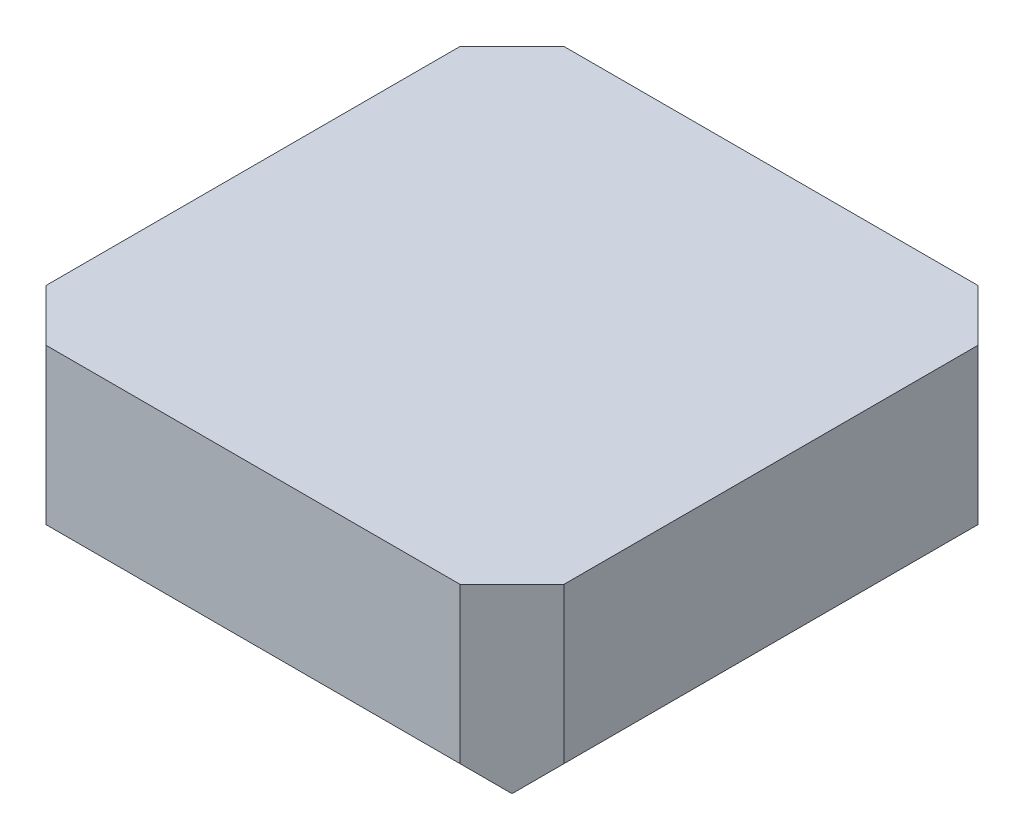
ISO-10303-21;
HEADER;
FILE_DESCRIPTION(('STEP AP214'),'2;1');
FILE_NAME('part.step','',(''),(''),'','','');
FILE_SCHEMA(('AUTOMOTIVE_DESIGN { 1 0 10303 214 1 1 1 1 }'));
ENDSEC;
DATA;
#1=APPLICATION_CONTEXT('core data for automotive mechanical design processes');
#2=APPLICATION_PROTOCOL_DEFINITION('international standard','automotive_design',2000,#1);
#3=PRODUCT_CONTEXT('',#1,'mechanical');
#4=PRODUCT('Part','Part','',(#3));
#5=PRODUCT_RELATED_PRODUCT_CATEGORY('part','',(#4));
#6=PRODUCT_DEFINITION_FORMATION('','',#4);
#7=PRODUCT_DEFINITION_CONTEXT('part definition',#1,'design');
#8=PRODUCT_DEFINITION('design','',#6,#7);
#9=PRODUCT_DEFINITION_SHAPE('','',#8);
#10=(LENGTH_UNIT() NAMED_UNIT(*) SI_UNIT(.MILLI.,.METRE.));
#11=(NAMED_UNIT(*) PLANE_ANGLE_UNIT() SI_UNIT($,.RADIAN.));
#12=(NAMED_UNIT(*) SI_UNIT($,.STERADIAN.) SOLID_ANGLE_UNIT());
#13=UNCERTAINTY_MEASURE_WITH_UNIT(LENGTH_MEASURE(1.E-05),#10,'distance_accuracy_value','');
#14=(GEOMETRIC_REPRESENTATION_CONTEXT(3) GLOBAL_UNCERTAINTY_ASSIGNED_CONTEXT((#13)) GLOBAL_UNIT_ASSIGNED_CONTEXT((#10,
#11,#12)) REPRESENTATION_CONTEXT('',''));
#15=CARTESIAN_POINT('',(0.,0.,0.));
#16=DIRECTION('',(0.,0.,1.));
#17=DIRECTION('',(1.,0.,0.));
#18=AXIS2_PLACEMENT_3D('',#15,#16,#17);
#19=CARTESIAN_POINT('',(5.,6.,5.));
#20=DIRECTION('',(-1.,0.,0.));
#21=DIRECTION('',(0.,0.,1.));
#22=AXIS2_PLACEMENT_3D('',#19,#20,#21);
#23=PLANE('',#22);
#24=DIRECTION('',(0.,0.,-1.));
#25=VECTOR('',#24,1.);
#26=CARTESIAN_POINT('',(5.,3.,-5.));
#27=LINE('',#26,#25);
#28=CARTESIAN_POINT('',(5.,3.,4.));
#29=VERTEX_POINT('',#28);
#30=CARTESIAN_POINT('',(5.,3.,-4.));
#31=VERTEX_POINT('',#30);
#32=EDGE_CURVE('E160',#29,#31,#27,.T.);
#33=ORIENTED_EDGE('',*,*,#32,.T.);
#34=DIRECTION('',(0.,1.,0.));
#35=VECTOR('',#34,1.);
#36=CARTESIAN_POINT('',(5.,6.,-4.));
#37=LINE('',#36,#35);
#38=CARTESIAN_POINT('',(5.,6.,-4.));
#39=VERTEX_POINT('',#38);
#40=EDGE_CURVE('E182',#31,#39,#37,.T.);
#41=ORIENTED_EDGE('',*,*,#40,.T.);
#42=DIRECTION('',(0.,0.,-1.));
#43=VECTOR('',#42,1.);
#44=CARTESIAN_POINT('',(5.,6.,5.));
#45=LINE('',#44,#43);
#46=CARTESIAN_POINT('',(5.,6.,4.));
#47=VERTEX_POINT('',#46);
#48=EDGE_CURVE('E167',#47,#39,#45,.T.);
#49=ORIENTED_EDGE('',*,*,#48,.F.);
#50=DIRECTION('',(0.,-1.,0.));
#51=VECTOR('',#50,1.);
#52=CARTESIAN_POINT('',(5.,6.,4.));
#53=LINE('',#52,#51);
#54=EDGE_CURVE('E179',#47,#29,#53,.T.);
#55=ORIENTED_EDGE('',*,*,#54,.T.);
#56=EDGE_LOOP('',(#33,#41,#49,#55));
#57=FACE_BOUND('',#56,.T.);
#58=ADVANCED_FACE('F33',(#57),#23,.F.);
#59=CARTESIAN_POINT('',(-5.,6.,-5.));
#60=DIRECTION('',(0.,0.,1.));
#61=DIRECTION('',(1.,0.,0.));
#62=AXIS2_PLACEMENT_3D('',#59,#60,#61);
#63=PLANE('',#62);
#64=DIRECTION('',(-1.,0.,0.));
#65=VECTOR('',#64,1.);
#66=CARTESIAN_POINT('',(-5.,6.,-5.));
#67=LINE('',#66,#65);
#68=CARTESIAN_POINT('',(4.00000000000001,6.,-5.));
#69=VERTEX_POINT('',#68);
#70=CARTESIAN_POINT('',(-4.,6.,-5.));
#71=VERTEX_POINT('',#70);
#72=EDGE_CURVE('E216',#69,#71,#67,.T.);
#73=ORIENTED_EDGE('',*,*,#72,.F.);
#74=DIRECTION('',(0.,-1.,0.));
#75=VECTOR('',#74,1.);
#76=CARTESIAN_POINT('',(4.,6.,-5.));
#77=LINE('',#76,#75);
#78=CARTESIAN_POINT('',(4.,3.,-5.));
#79=VERTEX_POINT('',#78);
#80=EDGE_CURVE('E169',#69,#79,#77,.T.);
#81=ORIENTED_EDGE('',*,*,#80,.T.);
#82=DIRECTION('',(-1.,0.,0.));
#83=VECTOR('',#82,1.);
#84=CARTESIAN_POINT('',(-5.,3.,-5.));
#85=LINE('',#84,#83);
#86=CARTESIAN_POINT('',(-4.,3.,-5.));
#87=VERTEX_POINT('',#86);
#88=EDGE_CURVE('E146',#79,#87,#85,.T.);
#89=ORIENTED_EDGE('',*,*,#88,.T.);
#90=DIRECTION('',(0.,1.,0.));
#91=VECTOR('',#90,1.);
#92=CARTESIAN_POINT('',(-4.,6.,-5.));
#93=LINE('',#92,#91);
#94=EDGE_CURVE('E163',#87,#71,#93,.T.);
#95=ORIENTED_EDGE('',*,*,#94,.T.);
#96=EDGE_LOOP('',(#73,#81,#89,#95));
#97=FACE_BOUND('',#96,.T.);
#98=ADVANCED_FACE('F215',(#97),#63,.F.);
#99=CARTESIAN_POINT('',(-5.,6.,5.));
#100=DIRECTION('',(1.,0.,0.));
#101=DIRECTION('',(0.,0.,-1.));
#102=AXIS2_PLACEMENT_3D('',#99,#100,#101);
#103=PLANE('',#102);
#104=DIRECTION('',(0.,0.,1.));
#105=VECTOR('',#104,1.);
#106=CARTESIAN_POINT('',(-5.,3.,5.));
#107=LINE('',#106,#105);
#108=CARTESIAN_POINT('',(-5.,3.,-4.));
#109=VERTEX_POINT('',#108);
#110=CARTESIAN_POINT('',(-5.,3.,4.));
#111=VERTEX_POINT('',#110);
#112=EDGE_CURVE('E151',#109,#111,#107,.T.);
#113=ORIENTED_EDGE('',*,*,#112,.T.);
#114=DIRECTION('',(0.,1.,0.));
#115=VECTOR('',#114,1.);
#116=CARTESIAN_POINT('',(-5.,6.,4.));
#117=LINE('',#116,#115);
#118=CARTESIAN_POINT('',(-5.,6.,4.));
#119=VERTEX_POINT('',#118);
#120=EDGE_CURVE('E11',#111,#119,#117,.T.);
#121=ORIENTED_EDGE('',*,*,#120,.T.);
#122=DIRECTION('',(0.,0.,1.));
#123=VECTOR('',#122,1.);
#124=CARTESIAN_POINT('',(-5.,6.,5.));
#125=LINE('',#124,#123);
#126=CARTESIAN_POINT('',(-5.,6.,-4.));
#127=VERTEX_POINT('',#126);
#128=EDGE_CURVE('E207',#127,#119,#125,.T.);
#129=ORIENTED_EDGE('',*,*,#128,.F.);
#130=DIRECTION('',(0.,-1.,0.));
#131=VECTOR('',#130,1.);
#132=CARTESIAN_POINT('',(-5.,6.,-4.));
#133=LINE('',#132,#131);
#134=EDGE_CURVE('E41',#127,#109,#133,.T.);
#135=ORIENTED_EDGE('',*,*,#134,.T.);
#136=EDGE_LOOP('',(#113,#121,#129,#135));
#137=FACE_BOUND('',#136,.T.);
#138=ADVANCED_FACE('F204',(#137),#103,.F.);
#139=CARTESIAN_POINT('',(-5.,6.,5.));
#140=DIRECTION('',(0.,0.,-1.));
#141=DIRECTION('',(-1.,0.,0.));
#142=AXIS2_PLACEMENT_3D('',#139,#140,#141);
#143=PLANE('',#142);
#144=DIRECTION('',(1.,0.,0.));
#145=VECTOR('',#144,1.);
#146=CARTESIAN_POINT('',(5.,3.,5.));
#147=LINE('',#146,#145);
#148=CARTESIAN_POINT('',(-4.,3.,5.));
#149=VERTEX_POINT('',#148);
#150=CARTESIAN_POINT('',(4.,3.,5.));
#151=VERTEX_POINT('',#150);
#152=EDGE_CURVE('E153',#149,#151,#147,.T.);
#153=ORIENTED_EDGE('',*,*,#152,.T.);
#154=DIRECTION('',(0.,1.,0.));
#155=VECTOR('',#154,1.);
#156=CARTESIAN_POINT('',(4.,6.,5.));
#157=LINE('',#156,#155);
#158=CARTESIAN_POINT('',(4.,6.,5.));
#159=VERTEX_POINT('',#158);
#160=EDGE_CURVE('E199',#151,#159,#157,.T.);
#161=ORIENTED_EDGE('',*,*,#160,.T.);
#162=DIRECTION('',(1.,0.,0.));
#163=VECTOR('',#162,1.);
#164=CARTESIAN_POINT('',(-5.,6.,5.));
#165=LINE('',#164,#163);
#166=CARTESIAN_POINT('',(-4.,6.,5.));
#167=VERTEX_POINT('',#166);
#168=EDGE_CURVE('E223',#167,#159,#165,.T.);
#169=ORIENTED_EDGE('',*,*,#168,.F.);
#170=DIRECTION('',(0.,-1.,0.));
#171=VECTOR('',#170,1.);
#172=CARTESIAN_POINT('',(-4.,6.,5.));
#173=LINE('',#172,#171);
#174=EDGE_CURVE('E196',#167,#149,#173,.T.);
#175=ORIENTED_EDGE('',*,*,#174,.T.);
#176=EDGE_LOOP('',(#153,#161,#169,#175));
#177=FACE_BOUND('',#176,.T.);
#178=ADVANCED_FACE('F240',(#177),#143,.F.);
#179=CARTESIAN_POINT('',(0.,6.,0.));
#180=DIRECTION('',(0.,-1.,0.));
#181=DIRECTION('',(0.,0.,-1.));
#182=AXIS2_PLACEMENT_3D('',#179,#180,#181);
#183=PLANE('',#182);
#184=ORIENTED_EDGE('',*,*,#48,.T.);
#185=DIRECTION('',(0.707106781186546,0.,0.707106781186549));
#186=VECTOR('',#185,1.);
#187=CARTESIAN_POINT('',(4.,6.,-5.));
#188=LINE('',#187,#186);
#189=EDGE_CURVE('E190',#39,#69,#188,.F.);
#190=ORIENTED_EDGE('',*,*,#189,.T.);
#191=ORIENTED_EDGE('',*,*,#72,.T.);
#192=DIRECTION('',(0.707106781186549,0.,-0.707106781186546));
#193=VECTOR('',#192,1.);
#194=CARTESIAN_POINT('',(-5.,6.,-4.));
#195=LINE('',#194,#193);
#196=EDGE_CURVE('E184',#71,#127,#195,.F.);
#197=ORIENTED_EDGE('',*,*,#196,.T.);
#198=ORIENTED_EDGE('',*,*,#128,.T.);
#199=DIRECTION('',(-0.707106781186546,0.,-0.707106781186549));
#200=VECTOR('',#199,1.);
#201=CARTESIAN_POINT('',(-4.,6.,5.));
#202=LINE('',#201,#200);
#203=EDGE_CURVE('E186',#119,#167,#202,.F.);
#204=ORIENTED_EDGE('',*,*,#203,.T.);
#205=ORIENTED_EDGE('',*,*,#168,.T.);
#206=DIRECTION('',(-0.707106781186549,0.,0.707106781186546));
#207=VECTOR('',#206,1.);
#208=CARTESIAN_POINT('',(5.,6.,4.));
#209=LINE('',#208,#207);
#210=EDGE_CURVE('E188',#159,#47,#209,.F.);
#211=ORIENTED_EDGE('',*,*,#210,.T.);
#212=EDGE_LOOP('',(#184,#190,#191,#197,#198,#204,#205,#211));
#213=FACE_BOUND('',#212,.T.);
#214=ADVANCED_FACE('F220',(#213),#183,.F.);
#215=CARTESIAN_POINT('',(0.,0.,0.));
#216=DIRECTION('',(0.,-1.,0.));
#217=DIRECTION('',(0.,0.,-1.));
#218=AXIS2_PLACEMENT_3D('',#215,#216,#217);
#219=PLANE('',#218);
#220=DIRECTION('',(0.,0.,-1.));
#221=VECTOR('',#220,1.);
#222=CARTESIAN_POINT('',(-1.99999999999999,0.,-5.));
#223=LINE('',#222,#221);
#224=CARTESIAN_POINT('',(-1.99999999999999,0.,1.99999999999999));
#225=VERTEX_POINT('',#224);
#226=CARTESIAN_POINT('',(-1.99999999999999,0.,-1.99999999999999));
#227=VERTEX_POINT('',#226);
#228=EDGE_CURVE('E150',#225,#227,#223,.T.);
#229=ORIENTED_EDGE('',*,*,#228,.T.);
#230=DIRECTION('',(1.,0.,0.));
#231=VECTOR('',#230,1.);
#232=CARTESIAN_POINT('',(5.,0.,-1.99999999999999));
#233=LINE('',#232,#231);
#234=CARTESIAN_POINT('',(1.99999999999999,0.,-1.99999999999999));
#235=VERTEX_POINT('',#234);
#236=EDGE_CURVE('E130',#227,#235,#233,.T.);
#237=ORIENTED_EDGE('',*,*,#236,.T.);
#238=DIRECTION('',(0.,0.,1.));
#239=VECTOR('',#238,1.);
#240=CARTESIAN_POINT('',(1.99999999999999,0.,5.));
#241=LINE('',#240,#239);
#242=CARTESIAN_POINT('',(1.99999999999999,0.,1.99999999999999));
#243=VERTEX_POINT('',#242);
#244=EDGE_CURVE('E139',#235,#243,#241,.T.);
#245=ORIENTED_EDGE('',*,*,#244,.T.);
#246=DIRECTION('',(-1.,0.,0.));
#247=VECTOR('',#246,1.);
#248=CARTESIAN_POINT('',(-5.,0.,1.99999999999999));
#249=LINE('',#248,#247);
#250=EDGE_CURVE('E145',#243,#225,#249,.T.);
#251=ORIENTED_EDGE('',*,*,#250,.T.);
#252=EDGE_LOOP('',(#229,#237,#245,#251));
#253=FACE_BOUND('',#252,.T.);
#254=ADVANCED_FACE('F148',(#253),#219,.T.);
#255=CARTESIAN_POINT('',(-5.,3.,5.));
#256=DIRECTION('',(0.,-0.707106781186549,0.707106781186546));
#257=DIRECTION('',(-1.,0.,0.));
#258=AXIS2_PLACEMENT_3D('',#255,#256,#257);
#259=PLANE('',#258);
#260=DIRECTION('',(-0.577350269189626,-0.577350269189624,-0.577350269189626));
#261=VECTOR('',#260,1.);
#262=CARTESIAN_POINT('',(5.,3.,5.));
#263=LINE('',#262,#261);
#264=CARTESIAN_POINT('',(4.5,2.5,4.5));
#265=VERTEX_POINT('',#264);
#266=EDGE_CURVE('E142',#265,#243,#263,.T.);
#267=ORIENTED_EDGE('',*,*,#266,.F.);
#268=DIRECTION('',(0.577350269189628,-0.577350269189624,-0.577350269189626));
#269=VECTOR('',#268,1.);
#270=CARTESIAN_POINT('',(0.999999999999979,6.,8.00000000000001));
#271=LINE('',#270,#269);
#272=EDGE_CURVE('E194',#265,#151,#271,.F.);
#273=ORIENTED_EDGE('',*,*,#272,.T.);
#274=ORIENTED_EDGE('',*,*,#152,.F.);
#275=DIRECTION('',(0.577350269189624,0.577350269189625,0.577350269189627));
#276=VECTOR('',#275,1.);
#277=CARTESIAN_POINT('',(-4.33333333333333,2.66666666666667,4.66666666666667));
#278=LINE('',#277,#276);
#279=CARTESIAN_POINT('',(-4.5,2.5,4.5));
#280=VERTEX_POINT('',#279);
#281=EDGE_CURVE('E192',#149,#280,#278,.F.);
#282=ORIENTED_EDGE('',*,*,#281,.T.);
#283=DIRECTION('',(0.577350269189626,-0.577350269189624,-0.577350269189626));
#284=VECTOR('',#283,1.);
#285=CARTESIAN_POINT('',(-5.,3.,5.));
#286=LINE('',#285,#284);
#287=EDGE_CURVE('E135',#225,#280,#286,.F.);
#288=ORIENTED_EDGE('',*,*,#287,.F.);
#289=ORIENTED_EDGE('',*,*,#250,.F.);
#290=EDGE_LOOP('',(#267,#273,#274,#282,#288,#289));
#291=FACE_BOUND('',#290,.T.);
#292=ADVANCED_FACE('F231',(#291),#259,.T.);
#293=CARTESIAN_POINT('',(5.,3.,5.));
#294=DIRECTION('',(0.707106781186546,-0.707106781186549,0.));
#295=DIRECTION('',(0.,0.,1.));
#296=AXIS2_PLACEMENT_3D('',#293,#294,#295);
#297=PLANE('',#296);
#298=DIRECTION('',(0.577350269189626,0.577350269189624,-0.577350269189626));
#299=VECTOR('',#298,1.);
#300=CARTESIAN_POINT('',(1.66666666666666,-0.33333333333333,-1.66666666666666));
#301=LINE('',#300,#299);
#302=CARTESIAN_POINT('',(4.5,2.5,-4.5));
#303=VERTEX_POINT('',#302);
#304=EDGE_CURVE('E124',#303,#235,#301,.F.);
#305=ORIENTED_EDGE('',*,*,#304,.F.);
#306=DIRECTION('',(-0.577350269189626,-0.577350269189624,-0.577350269189628));
#307=VECTOR('',#306,1.);
#308=CARTESIAN_POINT('',(8.00000000000001,6.,-0.999999999999978));
#309=LINE('',#308,#307);
#310=EDGE_CURVE('E177',#303,#31,#309,.F.);
#311=ORIENTED_EDGE('',*,*,#310,.T.);
#312=ORIENTED_EDGE('',*,*,#32,.F.);
#313=DIRECTION('',(0.577350269189627,0.577350269189625,-0.577350269189625));
#314=VECTOR('',#313,1.);
#315=CARTESIAN_POINT('',(4.66666666666667,2.66666666666667,4.33333333333333));
#316=LINE('',#315,#314);
#317=EDGE_CURVE('E175',#29,#265,#316,.F.);
#318=ORIENTED_EDGE('',*,*,#317,.T.);
#319=ORIENTED_EDGE('',*,*,#266,.T.);
#320=ORIENTED_EDGE('',*,*,#244,.F.);
#321=EDGE_LOOP('',(#305,#311,#312,#318,#319,#320));
#322=FACE_BOUND('',#321,.T.);
#323=ADVANCED_FACE('F140',(#322),#297,.T.);
#324=CARTESIAN_POINT('',(-5.,3.,5.));
#325=DIRECTION('',(-0.707106781186546,-0.707106781186549,0.));
#326=DIRECTION('',(0.,0.,-1.));
#327=AXIS2_PLACEMENT_3D('',#324,#325,#326);
#328=PLANE('',#327);
#329=ORIENTED_EDGE('',*,*,#287,.T.);
#330=DIRECTION('',(0.577350269189626,-0.577350269189624,0.577350269189629));
#331=VECTOR('',#330,1.);
#332=CARTESIAN_POINT('',(-4.66666666666666,2.66666666666666,4.33333333333333));
#333=LINE('',#332,#331);
#334=EDGE_CURVE('E48',#280,#111,#333,.F.);
#335=ORIENTED_EDGE('',*,*,#334,.T.);
#336=ORIENTED_EDGE('',*,*,#112,.F.);
#337=DIRECTION('',(-0.577350269189627,0.577350269189625,0.577350269189625));
#338=VECTOR('',#337,1.);
#339=CARTESIAN_POINT('',(-8.,5.99999999999999,-1.00000000000001));
#340=LINE('',#339,#338);
#341=CARTESIAN_POINT('',(-4.5,2.5,-4.5));
#342=VERTEX_POINT('',#341);
#343=EDGE_CURVE('E56',#109,#342,#340,.F.);
#344=ORIENTED_EDGE('',*,*,#343,.T.);
#345=DIRECTION('',(0.577350269189626,-0.577350269189624,0.577350269189626));
#346=VECTOR('',#345,1.);
#347=CARTESIAN_POINT('',(-1.66666666666666,-0.33333333333333,-1.66666666666666));
#348=LINE('',#347,#346);
#349=EDGE_CURVE('E136',#227,#342,#348,.F.);
#350=ORIENTED_EDGE('',*,*,#349,.F.);
#351=ORIENTED_EDGE('',*,*,#228,.F.);
#352=EDGE_LOOP('',(#329,#335,#336,#344,#350,#351));
#353=FACE_BOUND('',#352,.T.);
#354=ADVANCED_FACE('F209',(#353),#328,.T.);
#355=CARTESIAN_POINT('',(-5.,3.,-5.));
#356=DIRECTION('',(0.,-0.707106781186549,-0.707106781186546));
#357=DIRECTION('',(1.,0.,0.));
#358=AXIS2_PLACEMENT_3D('',#355,#356,#357);
#359=PLANE('',#358);
#360=ORIENTED_EDGE('',*,*,#88,.F.);
#361=DIRECTION('',(-0.577350269189625,0.577350269189625,-0.577350269189627));
#362=VECTOR('',#361,1.);
#363=CARTESIAN_POINT('',(1.00000000000001,5.99999999999999,-8.));
#364=LINE('',#363,#362);
#365=EDGE_CURVE('E132',#79,#303,#364,.F.);
#366=ORIENTED_EDGE('',*,*,#365,.T.);
#367=ORIENTED_EDGE('',*,*,#304,.T.);
#368=ORIENTED_EDGE('',*,*,#236,.F.);
#369=ORIENTED_EDGE('',*,*,#349,.T.);
#370=DIRECTION('',(-0.577350269189628,-0.577350269189624,0.577350269189626));
#371=VECTOR('',#370,1.);
#372=CARTESIAN_POINT('',(-4.33333333333333,2.66666666666667,-4.66666666666667));
#373=LINE('',#372,#371);
#374=EDGE_CURVE('E172',#342,#87,#373,.F.);
#375=ORIENTED_EDGE('',*,*,#374,.T.);
#376=EDGE_LOOP('',(#360,#366,#367,#368,#369,#375));
#377=FACE_BOUND('',#376,.T.);
#378=ADVANCED_FACE('F127',(#377),#359,.T.);
#379=CARTESIAN_POINT('',(4.,6.,-5.));
#380=DIRECTION('',(-0.707106781186549,0.,0.707106781186546));
#381=DIRECTION('',(0.,-1.,0.));
#382=AXIS2_PLACEMENT_3D('',#379,#380,#381);
#383=PLANE('',#382);
#384=ORIENTED_EDGE('',*,*,#189,.F.);
#385=ORIENTED_EDGE('',*,*,#40,.F.);
#386=ORIENTED_EDGE('',*,*,#310,.F.);
#387=ORIENTED_EDGE('',*,*,#365,.F.);
#388=ORIENTED_EDGE('',*,*,#80,.F.);
#389=EDGE_LOOP('',(#384,#385,#386,#387,#388));
#390=FACE_BOUND('',#389,.T.);
#391=ADVANCED_FACE('F251',(#390),#383,.F.);
#392=CARTESIAN_POINT('',(5.,6.,4.));
#393=DIRECTION('',(-0.707106781186546,0.,-0.707106781186549));
#394=DIRECTION('',(0.,-1.,0.));
#395=AXIS2_PLACEMENT_3D('',#392,#393,#394);
#396=PLANE('',#395);
#397=ORIENTED_EDGE('',*,*,#210,.F.);
#398=ORIENTED_EDGE('',*,*,#160,.F.);
#399=ORIENTED_EDGE('',*,*,#272,.F.);
#400=ORIENTED_EDGE('',*,*,#317,.F.);
#401=ORIENTED_EDGE('',*,*,#54,.F.);
#402=EDGE_LOOP('',(#397,#398,#399,#400,#401));
#403=FACE_BOUND('',#402,.T.);
#404=ADVANCED_FACE('F244',(#403),#396,.F.);
#405=CARTESIAN_POINT('',(-4.,6.,5.));
#406=DIRECTION('',(0.707106781186549,0.,-0.707106781186546));
#407=DIRECTION('',(0.,-1.,0.));
#408=AXIS2_PLACEMENT_3D('',#405,#406,#407);
#409=PLANE('',#408);
#410=ORIENTED_EDGE('',*,*,#203,.F.);
#411=ORIENTED_EDGE('',*,*,#120,.F.);
#412=ORIENTED_EDGE('',*,*,#334,.F.);
#413=ORIENTED_EDGE('',*,*,#281,.F.);
#414=ORIENTED_EDGE('',*,*,#174,.F.);
#415=EDGE_LOOP('',(#410,#411,#412,#413,#414));
#416=FACE_BOUND('',#415,.T.);
#417=ADVANCED_FACE('F235',(#416),#409,.F.);
#418=CARTESIAN_POINT('',(-5.,6.,-4.));
#419=DIRECTION('',(0.707106781186546,0.,0.707106781186549));
#420=DIRECTION('',(0.,-1.,0.));
#421=AXIS2_PLACEMENT_3D('',#418,#419,#420);
#422=PLANE('',#421);
#423=ORIENTED_EDGE('',*,*,#196,.F.);
#424=ORIENTED_EDGE('',*,*,#94,.F.);
#425=ORIENTED_EDGE('',*,*,#374,.F.);
#426=ORIENTED_EDGE('',*,*,#343,.F.);
#427=ORIENTED_EDGE('',*,*,#134,.F.);
#428=EDGE_LOOP('',(#423,#424,#425,#426,#427));
#429=FACE_BOUND('',#428,.T.);
#430=ADVANCED_FACE('F35',(#429),#422,.F.);
#431=CLOSED_SHELL('',(#58,#98,#138,#178,#214,#254,#292,#323,#354,#378,#391,#404,#417,#430));
#432=MANIFOLD_SOLID_BREP('B2',#431);
#433=ADVANCED_BREP_SHAPE_REPRESENTATION('',(#18,#432),#14);
#434=SHAPE_DEFINITION_REPRESENTATION(#9,#433);
ENDSEC;
END-ISO-10303-21;
